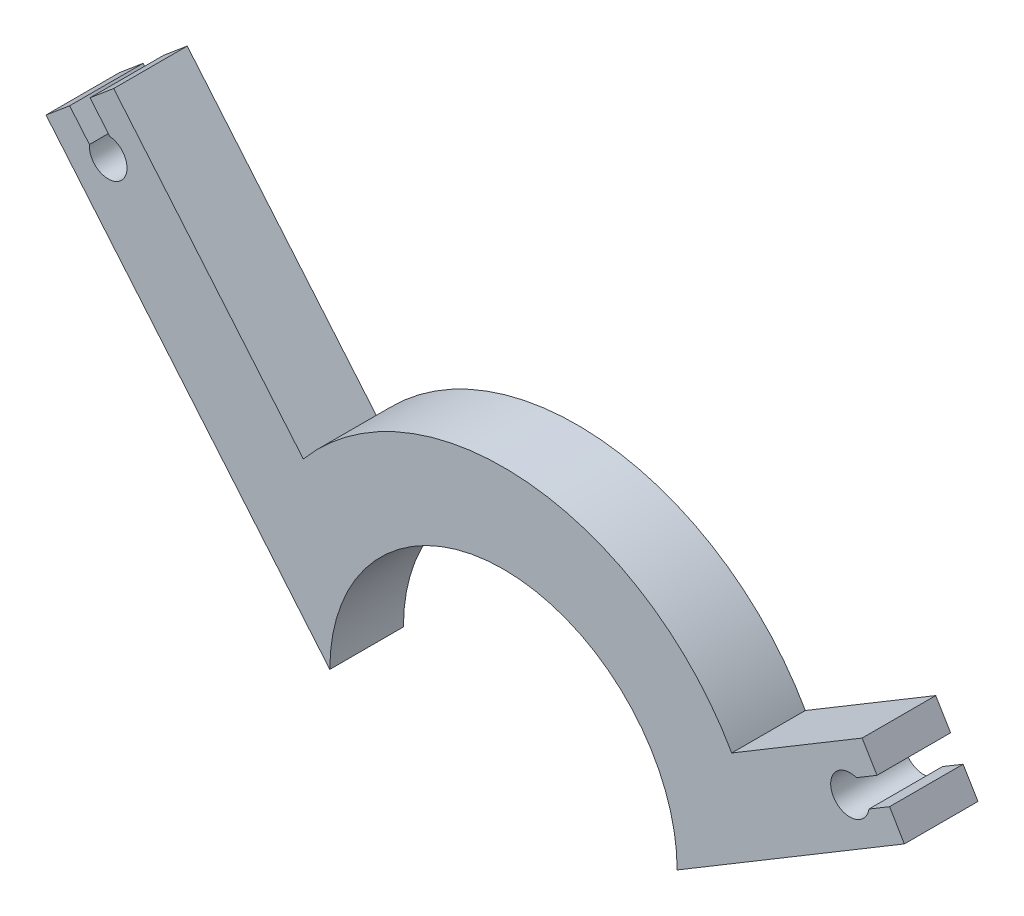
ISO-10303-21;
HEADER;
FILE_DESCRIPTION(('STEP AP214'),'2;1');
FILE_NAME('part.step','',(''),(''),'','','');
FILE_SCHEMA(('AUTOMOTIVE_DESIGN { 1 0 10303 214 1 1 1 1 }'));
ENDSEC;
DATA;
#1=APPLICATION_CONTEXT('core data for automotive mechanical design processes');
#2=APPLICATION_PROTOCOL_DEFINITION('international standard','automotive_design',2000,#1);
#3=PRODUCT_CONTEXT('',#1,'mechanical');
#4=PRODUCT('Part','Part','',(#3));
#5=PRODUCT_RELATED_PRODUCT_CATEGORY('part','',(#4));
#6=PRODUCT_DEFINITION_FORMATION('','',#4);
#7=PRODUCT_DEFINITION_CONTEXT('part definition',#1,'design');
#8=PRODUCT_DEFINITION('design','',#6,#7);
#9=PRODUCT_DEFINITION_SHAPE('','',#8);
#10=(LENGTH_UNIT() NAMED_UNIT(*) SI_UNIT(.MILLI.,.METRE.));
#11=(NAMED_UNIT(*) PLANE_ANGLE_UNIT() SI_UNIT($,.RADIAN.));
#12=(NAMED_UNIT(*) SI_UNIT($,.STERADIAN.) SOLID_ANGLE_UNIT());
#13=UNCERTAINTY_MEASURE_WITH_UNIT(LENGTH_MEASURE(1.E-05),#10,'distance_accuracy_value','');
#14=(GEOMETRIC_REPRESENTATION_CONTEXT(3) GLOBAL_UNCERTAINTY_ASSIGNED_CONTEXT((#13)) GLOBAL_UNIT_ASSIGNED_CONTEXT((#10,
#11,#12)) REPRESENTATION_CONTEXT('',''));
#15=CARTESIAN_POINT('',(0.,0.,0.));
#16=DIRECTION('',(0.,0.,1.));
#17=DIRECTION('',(1.,0.,0.));
#18=AXIS2_PLACEMENT_3D('',#15,#16,#17);
#19=CARTESIAN_POINT('',(0.,0.,1.5875));
#20=DIRECTION('',(0.,0.,-1.));
#21=DIRECTION('',(-1.,0.,0.));
#22=AXIS2_PLACEMENT_3D('',#19,#20,#21);
#23=CYLINDRICAL_SURFACE('',#22,3.7465);
#24=CARTESIAN_POINT('',(0.,0.,0.));
#25=DIRECTION('',(0.,0.,-1.));
#26=DIRECTION('',(1.,0.,0.));
#27=AXIS2_PLACEMENT_3D('',#24,#25,#26);
#28=CIRCLE('',#27,3.7465);
#29=CARTESIAN_POINT('',(-3.7465,0.,0.));
#30=VERTEX_POINT('',#29);
#31=CARTESIAN_POINT('',(3.7465,0.,0.));
#32=VERTEX_POINT('',#31);
#33=EDGE_CURVE('E176',#30,#32,#28,.T.);
#34=ORIENTED_EDGE('',*,*,#33,.T.);
#35=DIRECTION('',(0.,0.,-1.));
#36=VECTOR('',#35,1.);
#37=CARTESIAN_POINT('',(3.7465,0.,1.5875));
#38=LINE('',#37,#36);
#39=CARTESIAN_POINT('',(3.7465,0.,1.5875));
#40=VERTEX_POINT('',#39);
#41=EDGE_CURVE('E11',#40,#32,#38,.T.);
#42=ORIENTED_EDGE('',*,*,#41,.F.);
#43=CARTESIAN_POINT('',(0.,0.,1.5875));
#44=DIRECTION('',(0.,0.,-1.));
#45=DIRECTION('',(1.,0.,0.));
#46=AXIS2_PLACEMENT_3D('',#43,#44,#45);
#47=CIRCLE('',#46,3.7465);
#48=CARTESIAN_POINT('',(-3.7465,0.,1.5875));
#49=VERTEX_POINT('',#48);
#50=EDGE_CURVE('E206',#49,#40,#47,.T.);
#51=ORIENTED_EDGE('',*,*,#50,.F.);
#52=DIRECTION('',(0.,0.,-1.));
#53=VECTOR('',#52,1.);
#54=CARTESIAN_POINT('',(-3.7465,0.,1.5875));
#55=LINE('',#54,#53);
#56=EDGE_CURVE('E172',#49,#30,#55,.T.);
#57=ORIENTED_EDGE('',*,*,#56,.T.);
#58=EDGE_LOOP('',(#34,#42,#51,#57));
#59=FACE_BOUND('',#58,.T.);
#60=ADVANCED_FACE('F32',(#59),#23,.F.);
#61=CARTESIAN_POINT('',(3.7465,0.,1.5875));
#62=DIRECTION('',(-0.51400178949124,0.857789111844982,0.));
#63=DIRECTION('',(-0.857789111844982,-0.51400178949124,0.));
#64=AXIS2_PLACEMENT_3D('',#61,#62,#63);
#65=PLANE('',#64);
#66=DIRECTION('',(0.857789111844982,0.51400178949124,0.));
#67=VECTOR('',#66,1.);
#68=CARTESIAN_POINT('',(3.7465,0.,0.));
#69=LINE('',#68,#67);
#70=CARTESIAN_POINT('',(8.64876477419407,2.93752022694244,0.));
#71=VERTEX_POINT('',#70);
#72=EDGE_CURVE('E179',#32,#71,#69,.T.);
#73=ORIENTED_EDGE('',*,*,#72,.T.);
#74=DIRECTION('',(0.,0.,-1.));
#75=VECTOR('',#74,1.);
#76=CARTESIAN_POINT('',(8.64876477419407,2.93752022694244,1.5875));
#77=LINE('',#76,#75);
#78=CARTESIAN_POINT('',(8.64876477419407,2.93752022694244,1.5875));
#79=VERTEX_POINT('',#78);
#80=EDGE_CURVE('E40',#79,#71,#77,.T.);
#81=ORIENTED_EDGE('',*,*,#80,.F.);
#82=DIRECTION('',(0.857789111844982,0.51400178949124,0.));
#83=VECTOR('',#82,1.);
#84=CARTESIAN_POINT('',(3.7465,0.,1.5875));
#85=LINE('',#84,#83);
#86=EDGE_CURVE('E115',#40,#79,#85,.T.);
#87=ORIENTED_EDGE('',*,*,#86,.F.);
#88=ORIENTED_EDGE('',*,*,#41,.T.);
#89=EDGE_LOOP('',(#73,#81,#87,#88));
#90=FACE_BOUND('',#89,.T.);
#91=ADVANCED_FACE('F304',(#90),#65,.F.);
#92=CARTESIAN_POINT('',(8.64876477419407,2.93752022694244,1.5875));
#93=DIRECTION('',(-0.857789111844981,-0.514001789491241,0.));
#94=DIRECTION('',(0.514001789491241,-0.857789111844981,0.));
#95=AXIS2_PLACEMENT_3D('',#92,#93,#94);
#96=PLANE('',#95);
#97=DIRECTION('',(-0.514001789491241,0.857789111844981,0.));
#98=VECTOR('',#97,1.);
#99=CARTESIAN_POINT('',(8.64876477419407,2.93752022694244,0.));
#100=LINE('',#99,#98);
#101=CARTESIAN_POINT('',(8.32784963015071,3.4730777328006,0.));
#102=VERTEX_POINT('',#101);
#103=EDGE_CURVE('E181',#71,#102,#100,.T.);
#104=ORIENTED_EDGE('',*,*,#103,.T.);
#105=DIRECTION('',(0.,0.,-1.));
#106=VECTOR('',#105,1.);
#107=CARTESIAN_POINT('',(8.32784963015071,3.4730777328006,1.5875));
#108=LINE('',#107,#106);
#109=CARTESIAN_POINT('',(8.32784963015071,3.4730777328006,1.5875));
#110=VERTEX_POINT('',#109);
#111=EDGE_CURVE('E237',#110,#102,#108,.T.);
#112=ORIENTED_EDGE('',*,*,#111,.F.);
#113=DIRECTION('',(-0.514001789491241,0.857789111844981,0.));
#114=VECTOR('',#113,1.);
#115=CARTESIAN_POINT('',(8.64876477419407,2.93752022694244,1.5875));
#116=LINE('',#115,#114);
#117=EDGE_CURVE('E245',#79,#110,#116,.T.);
#118=ORIENTED_EDGE('',*,*,#117,.F.);
#119=ORIENTED_EDGE('',*,*,#80,.T.);
#120=EDGE_LOOP('',(#104,#112,#118,#119));
#121=FACE_BOUND('',#120,.T.);
#122=ADVANCED_FACE('F243',(#121),#96,.F.);
#123=CARTESIAN_POINT('',(8.32784963015071,3.4730777328006,1.5875));
#124=DIRECTION('',(0.514001789491243,-0.85778911184498,0.));
#125=DIRECTION('',(0.85778911184498,0.514001789491243,0.));
#126=AXIS2_PLACEMENT_3D('',#123,#124,#125);
#127=PLANE('',#126);
#128=DIRECTION('',(-0.85778911184498,-0.514001789491243,0.));
#129=VECTOR('',#128,1.);
#130=CARTESIAN_POINT('',(8.32784963015071,3.4730777328006,0.));
#131=LINE('',#130,#129);
#132=CARTESIAN_POINT('',(7.88298717588792,3.20650860245023,0.));
#133=VERTEX_POINT('',#132);
#134=EDGE_CURVE('E183',#102,#133,#131,.T.);
#135=ORIENTED_EDGE('',*,*,#134,.T.);
#136=DIRECTION('',(0.,0.,-1.));
#137=VECTOR('',#136,1.);
#138=CARTESIAN_POINT('',(7.88298717588792,3.20650860245023,1.5875));
#139=LINE('',#138,#137);
#140=CARTESIAN_POINT('',(7.88298717588792,3.20650860245023,1.5875));
#141=VERTEX_POINT('',#140);
#142=EDGE_CURVE('E234',#141,#133,#139,.T.);
#143=ORIENTED_EDGE('',*,*,#142,.F.);
#144=DIRECTION('',(-0.85778911184498,-0.514001789491243,0.));
#145=VECTOR('',#144,1.);
#146=CARTESIAN_POINT('',(8.32784963015071,3.4730777328006,1.5875));
#147=LINE('',#146,#145);
#148=EDGE_CURVE('E263',#110,#141,#147,.T.);
#149=ORIENTED_EDGE('',*,*,#148,.F.);
#150=ORIENTED_EDGE('',*,*,#111,.T.);
#151=EDGE_LOOP('',(#135,#143,#149,#150));
#152=FACE_BOUND('',#151,.T.);
#153=ADVANCED_FACE('F254',(#152),#127,.F.);
#154=CARTESIAN_POINT('',(7.47262979513493,3.26709872392423,1.5875));
#155=DIRECTION('',(0.,0.,-1.));
#156=DIRECTION('',(-1.,0.,0.));
#157=AXIS2_PLACEMENT_3D('',#154,#155,#156);
#158=CYLINDRICAL_SURFACE('',#157,0.414806391897093);
#159=CARTESIAN_POINT('',(7.47262979513493,3.26709872392423,0.));
#160=DIRECTION('',(0.,0.,-1.));
#161=DIRECTION('',(1.,0.,0.));
#162=AXIS2_PLACEMENT_3D('',#159,#160,#161);
#163=CIRCLE('',#162,0.414806391897093);
#164=CARTESIAN_POINT('',(7.61272711717027,3.65753064259536,0.));
#165=VERTEX_POINT('',#164);
#166=EDGE_CURVE('E185',#133,#165,#163,.T.);
#167=ORIENTED_EDGE('',*,*,#166,.T.);
#168=DIRECTION('',(0.,0.,-1.));
#169=VECTOR('',#168,1.);
#170=CARTESIAN_POINT('',(7.61272711717027,3.65753064259536,1.5875));
#171=LINE('',#170,#169);
#172=CARTESIAN_POINT('',(7.61272711717027,3.65753064259536,1.5875));
#173=VERTEX_POINT('',#172);
#174=EDGE_CURVE('E231',#173,#165,#171,.T.);
#175=ORIENTED_EDGE('',*,*,#174,.F.);
#176=CARTESIAN_POINT('',(7.47262979513493,3.26709872392423,1.5875));
#177=DIRECTION('',(0.,0.,-1.));
#178=DIRECTION('',(1.,0.,0.));
#179=AXIS2_PLACEMENT_3D('',#176,#177,#178);
#180=CIRCLE('',#179,0.414806391897093);
#181=EDGE_CURVE('E260',#141,#173,#180,.T.);
#182=ORIENTED_EDGE('',*,*,#181,.F.);
#183=ORIENTED_EDGE('',*,*,#142,.T.);
#184=EDGE_LOOP('',(#167,#175,#182,#183));
#185=FACE_BOUND('',#184,.T.);
#186=ADVANCED_FACE('F258',(#185),#158,.F.);
#187=CARTESIAN_POINT('',(8.05758957143306,3.92409977294573,1.5875));
#188=DIRECTION('',(-0.514001789491239,0.857789111844983,0.));
#189=DIRECTION('',(-0.857789111844983,-0.514001789491239,0.));
#190=AXIS2_PLACEMENT_3D('',#187,#188,#189);
#191=PLANE('',#190);
#192=DIRECTION('',(0.857789111844983,0.514001789491239,0.));
#193=VECTOR('',#192,1.);
#194=CARTESIAN_POINT('',(8.05758957143306,3.92409977294573,0.));
#195=LINE('',#194,#193);
#196=CARTESIAN_POINT('',(8.05758957143306,3.92409977294573,0.));
#197=VERTEX_POINT('',#196);
#198=EDGE_CURVE('E187',#165,#197,#195,.T.);
#199=ORIENTED_EDGE('',*,*,#198,.T.);
#200=DIRECTION('',(0.,0.,-1.));
#201=VECTOR('',#200,1.);
#202=CARTESIAN_POINT('',(8.05758957143306,3.92409977294573,1.5875));
#203=LINE('',#202,#201);
#204=CARTESIAN_POINT('',(8.05758957143306,3.92409977294573,1.5875));
#205=VERTEX_POINT('',#204);
#206=EDGE_CURVE('E228',#205,#197,#203,.T.);
#207=ORIENTED_EDGE('',*,*,#206,.F.);
#208=DIRECTION('',(0.857789111844983,0.514001789491239,0.));
#209=VECTOR('',#208,1.);
#210=CARTESIAN_POINT('',(8.05758957143306,3.92409977294573,1.5875));
#211=LINE('',#210,#209);
#212=EDGE_CURVE('E262',#173,#205,#211,.T.);
#213=ORIENTED_EDGE('',*,*,#212,.F.);
#214=ORIENTED_EDGE('',*,*,#174,.T.);
#215=EDGE_LOOP('',(#199,#207,#213,#214));
#216=FACE_BOUND('',#215,.T.);
#217=ADVANCED_FACE('F317',(#216),#191,.F.);
#218=CARTESIAN_POINT('',(8.05758957143306,3.92409977294573,1.5875));
#219=DIRECTION('',(-0.857789111844982,-0.514001789491241,0.));
#220=DIRECTION('',(0.514001789491241,-0.857789111844982,0.));
#221=AXIS2_PLACEMENT_3D('',#218,#219,#220);
#222=PLANE('',#221);
#223=DIRECTION('',(-0.514001789491241,0.857789111844982,0.));
#224=VECTOR('',#223,1.);
#225=CARTESIAN_POINT('',(8.05758957143306,3.92409977294573,0.));
#226=LINE('',#225,#224);
#227=CARTESIAN_POINT('',(7.73667442738969,4.4596572788039,0.));
#228=VERTEX_POINT('',#227);
#229=EDGE_CURVE('E189',#197,#228,#226,.T.);
#230=ORIENTED_EDGE('',*,*,#229,.T.);
#231=DIRECTION('',(0.,0.,-1.));
#232=VECTOR('',#231,1.);
#233=CARTESIAN_POINT('',(7.73667442738969,4.4596572788039,1.5875));
#234=LINE('',#233,#232);
#235=CARTESIAN_POINT('',(7.73667442738969,4.4596572788039,1.5875));
#236=VERTEX_POINT('',#235);
#237=EDGE_CURVE('E225',#236,#228,#234,.T.);
#238=ORIENTED_EDGE('',*,*,#237,.F.);
#239=DIRECTION('',(-0.514001789491241,0.857789111844982,0.));
#240=VECTOR('',#239,1.);
#241=CARTESIAN_POINT('',(8.05758957143306,3.92409977294573,1.5875));
#242=LINE('',#241,#240);
#243=EDGE_CURVE('E265',#205,#236,#242,.T.);
#244=ORIENTED_EDGE('',*,*,#243,.F.);
#245=ORIENTED_EDGE('',*,*,#206,.T.);
#246=EDGE_LOOP('',(#230,#238,#244,#245));
#247=FACE_BOUND('',#246,.T.);
#248=ADVANCED_FACE('F320',(#247),#222,.F.);
#249=CARTESIAN_POINT('',(7.73667442738969,4.4596572788039,1.5875));
#250=DIRECTION('',(0.514001789491241,-0.857789111844982,0.));
#251=DIRECTION('',(0.857789111844982,0.514001789491241,0.));
#252=AXIS2_PLACEMENT_3D('',#249,#250,#251);
#253=PLANE('',#252);
#254=DIRECTION('',(-0.857789111844982,-0.514001789491241,0.));
#255=VECTOR('',#254,1.);
#256=CARTESIAN_POINT('',(7.73667442738969,4.4596572788039,0.));
#257=LINE('',#256,#255);
#258=CARTESIAN_POINT('',(4.92378631338093,2.77412699604084,0.));
#259=VERTEX_POINT('',#258);
#260=EDGE_CURVE('E191',#228,#259,#257,.T.);
#261=ORIENTED_EDGE('',*,*,#260,.T.);
#262=DIRECTION('',(0.,0.,-1.));
#263=VECTOR('',#262,1.);
#264=CARTESIAN_POINT('',(4.92378631338093,2.77412699604084,1.5875));
#265=LINE('',#264,#263);
#266=CARTESIAN_POINT('',(4.92378631338093,2.77412699604084,1.5875));
#267=VERTEX_POINT('',#266);
#268=EDGE_CURVE('E222',#267,#259,#265,.T.);
#269=ORIENTED_EDGE('',*,*,#268,.F.);
#270=DIRECTION('',(-0.857789111844982,-0.514001789491241,0.));
#271=VECTOR('',#270,1.);
#272=CARTESIAN_POINT('',(7.73667442738969,4.4596572788039,1.5875));
#273=LINE('',#272,#271);
#274=EDGE_CURVE('E271',#236,#267,#273,.T.);
#275=ORIENTED_EDGE('',*,*,#274,.F.);
#276=ORIENTED_EDGE('',*,*,#237,.T.);
#277=EDGE_LOOP('',(#261,#269,#275,#276));
#278=FACE_BOUND('',#277,.T.);
#279=ADVANCED_FACE('F324',(#278),#253,.F.);
#280=CARTESIAN_POINT('',(0.,0.,1.5875));
#281=DIRECTION('',(0.,0.,-1.));
#282=DIRECTION('',(-1.,0.,0.));
#283=AXIS2_PLACEMENT_3D('',#280,#281,#282);
#284=CYLINDRICAL_SURFACE('',#283,5.6515);
#285=CARTESIAN_POINT('',(0.,0.,0.));
#286=DIRECTION('',(0.,0.,1.));
#287=DIRECTION('',(1.,0.,0.));
#288=AXIS2_PLACEMENT_3D('',#285,#286,#287);
#289=CIRCLE('',#288,5.6515);
#290=CARTESIAN_POINT('',(-4.31858822378173,3.64544208614178,0.));
#291=VERTEX_POINT('',#290);
#292=EDGE_CURVE('E193',#259,#291,#289,.T.);
#293=ORIENTED_EDGE('',*,*,#292,.T.);
#294=DIRECTION('',(0.,0.,-1.));
#295=VECTOR('',#294,1.);
#296=CARTESIAN_POINT('',(-4.31858822378173,3.64544208614178,1.5875));
#297=LINE('',#296,#295);
#298=CARTESIAN_POINT('',(-4.31858822378173,3.64544208614178,1.5875));
#299=VERTEX_POINT('',#298);
#300=EDGE_CURVE('E219',#299,#291,#297,.T.);
#301=ORIENTED_EDGE('',*,*,#300,.F.);
#302=CARTESIAN_POINT('',(0.,0.,1.5875));
#303=DIRECTION('',(0.,0.,1.));
#304=DIRECTION('',(1.,0.,0.));
#305=AXIS2_PLACEMENT_3D('',#302,#303,#304);
#306=CIRCLE('',#305,5.6515);
#307=EDGE_CURVE('E273',#267,#299,#306,.T.);
#308=ORIENTED_EDGE('',*,*,#307,.F.);
#309=ORIENTED_EDGE('',*,*,#268,.T.);
#310=EDGE_LOOP('',(#293,#301,#308,#309));
#311=FACE_BOUND('',#310,.T.);
#312=ADVANCED_FACE('F328',(#311),#284,.T.);
#313=CARTESIAN_POINT('',(-8.40973731812269,8.52108371716109,1.5875));
#314=DIRECTION('',(-0.766044443118973,-0.642787609686545,0.));
#315=DIRECTION('',(0.642787609686545,-0.766044443118973,0.));
#316=AXIS2_PLACEMENT_3D('',#313,#314,#315);
#317=PLANE('',#316);
#318=DIRECTION('',(-0.642787609686546,0.766044443118973,0.));
#319=VECTOR('',#318,1.);
#320=CARTESIAN_POINT('',(-8.40973731812269,8.52108371716109,0.));
#321=LINE('',#320,#319);
#322=CARTESIAN_POINT('',(-8.40973731812269,8.52108371716109,0.));
#323=VERTEX_POINT('',#322);
#324=EDGE_CURVE('E195',#291,#323,#321,.T.);
#325=ORIENTED_EDGE('',*,*,#324,.T.);
#326=DIRECTION('',(0.,0.,-1.));
#327=VECTOR('',#326,1.);
#328=CARTESIAN_POINT('',(-8.40973731812269,8.52108371716109,1.5875));
#329=LINE('',#328,#327);
#330=CARTESIAN_POINT('',(-8.40973731812269,8.52108371716109,1.5875));
#331=VERTEX_POINT('',#330);
#332=EDGE_CURVE('E216',#331,#323,#329,.T.);
#333=ORIENTED_EDGE('',*,*,#332,.F.);
#334=DIRECTION('',(-0.642787609686546,0.766044443118973,0.));
#335=VECTOR('',#334,1.);
#336=CARTESIAN_POINT('',(-8.40973731812269,8.52108371716109,1.5875));
#337=LINE('',#336,#335);
#338=EDGE_CURVE('E275',#299,#331,#337,.T.);
#339=ORIENTED_EDGE('',*,*,#338,.F.);
#340=ORIENTED_EDGE('',*,*,#300,.T.);
#341=EDGE_LOOP('',(#325,#333,#339,#340));
#342=FACE_BOUND('',#341,.T.);
#343=ADVANCED_FACE('F332',(#342),#317,.F.);
#344=CARTESIAN_POINT('',(-8.91925784061496,8.09354523466057,1.5875));
#345=DIRECTION('',(0.642787609686547,-0.766044443118971,0.));
#346=DIRECTION('',(0.766044443118971,0.642787609686548,0.));
#347=AXIS2_PLACEMENT_3D('',#344,#345,#346);
#348=PLANE('',#347);
#349=DIRECTION('',(-0.766044443118971,-0.642787609686548,0.));
#350=VECTOR('',#349,1.);
#351=CARTESIAN_POINT('',(-8.91925784061496,8.09354523466057,0.));
#352=LINE('',#351,#350);
#353=CARTESIAN_POINT('',(-8.91925784061496,8.09354523466057,0.));
#354=VERTEX_POINT('',#353);
#355=EDGE_CURVE('E197',#323,#354,#352,.T.);
#356=ORIENTED_EDGE('',*,*,#355,.T.);
#357=DIRECTION('',(0.,0.,-1.));
#358=VECTOR('',#357,1.);
#359=CARTESIAN_POINT('',(-8.91925784061496,8.09354523466057,1.5875));
#360=LINE('',#359,#358);
#361=CARTESIAN_POINT('',(-8.91925784061496,8.09354523466057,1.5875));
#362=VERTEX_POINT('',#361);
#363=EDGE_CURVE('E213',#362,#354,#360,.T.);
#364=ORIENTED_EDGE('',*,*,#363,.F.);
#365=DIRECTION('',(-0.766044443118971,-0.642787609686548,0.));
#366=VECTOR('',#365,1.);
#367=CARTESIAN_POINT('',(-8.91925784061496,8.09354523466057,1.5875));
#368=LINE('',#367,#366);
#369=EDGE_CURVE('E277',#331,#362,#368,.T.);
#370=ORIENTED_EDGE('',*,*,#369,.F.);
#371=ORIENTED_EDGE('',*,*,#332,.T.);
#372=EDGE_LOOP('',(#356,#364,#370,#371));
#373=FACE_BOUND('',#372,.T.);
#374=ADVANCED_FACE('F336',(#373),#348,.F.);
#375=CARTESIAN_POINT('',(-8.91925784061496,8.09354523466057,1.5875));
#376=DIRECTION('',(0.766044443118971,0.642787609686547,0.));
#377=DIRECTION('',(-0.642787609686547,0.766044443118971,0.));
#378=AXIS2_PLACEMENT_3D('',#375,#376,#377);
#379=PLANE('',#378);
#380=DIRECTION('',(0.642787609686547,-0.766044443118971,0.));
#381=VECTOR('',#380,1.);
#382=CARTESIAN_POINT('',(-8.91925784061496,8.09354523466057,0.));
#383=LINE('',#382,#381);
#384=CARTESIAN_POINT('',(-8.49171935811445,7.58402471216831,0.));
#385=VERTEX_POINT('',#384);
#386=EDGE_CURVE('E199',#354,#385,#383,.T.);
#387=ORIENTED_EDGE('',*,*,#386,.T.);
#388=DIRECTION('',(0.,0.,-1.));
#389=VECTOR('',#388,1.);
#390=CARTESIAN_POINT('',(-8.49171935811445,7.58402471216831,1.5875));
#391=LINE('',#390,#389);
#392=CARTESIAN_POINT('',(-8.49171935811445,7.58402471216831,1.5875));
#393=VERTEX_POINT('',#392);
#394=EDGE_CURVE('E210',#393,#385,#391,.T.);
#395=ORIENTED_EDGE('',*,*,#394,.F.);
#396=DIRECTION('',(0.642787609686547,-0.766044443118971,0.));
#397=VECTOR('',#396,1.);
#398=CARTESIAN_POINT('',(-8.91925784061496,8.09354523466057,1.5875));
#399=LINE('',#398,#397);
#400=EDGE_CURVE('E279',#362,#393,#399,.T.);
#401=ORIENTED_EDGE('',*,*,#400,.F.);
#402=ORIENTED_EDGE('',*,*,#363,.T.);
#403=EDGE_LOOP('',(#387,#395,#401,#402));
#404=FACE_BOUND('',#403,.T.);
#405=ADVANCED_FACE('F285',(#404),#379,.F.);
#406=CARTESIAN_POINT('',(-8.52713945196709,7.17917118686382,1.5875));
#407=DIRECTION('',(0.,0.,-1.));
#408=DIRECTION('',(-1.,0.,0.));
#409=AXIS2_PLACEMENT_3D('',#406,#407,#408);
#410=CYLINDRICAL_SURFACE('',#409,0.4064);
#411=CARTESIAN_POINT('',(-8.52713945196709,7.17917118686382,0.));
#412=DIRECTION('',(0.,0.,-1.));
#413=DIRECTION('',(1.,0.,0.));
#414=AXIS2_PLACEMENT_3D('',#411,#412,#413);
#415=CIRCLE('',#414,0.4064);
#416=CARTESIAN_POINT('',(-8.93199297727157,7.21459128071647,0.));
#417=VERTEX_POINT('',#416);
#418=EDGE_CURVE('E201',#385,#417,#415,.T.);
#419=ORIENTED_EDGE('',*,*,#418,.T.);
#420=DIRECTION('',(0.,0.,-1.));
#421=VECTOR('',#420,1.);
#422=CARTESIAN_POINT('',(-8.93199297727157,7.21459128071647,1.5875));
#423=LINE('',#422,#421);
#424=CARTESIAN_POINT('',(-8.93199297727157,7.21459128071647,1.5875));
#425=VERTEX_POINT('',#424);
#426=EDGE_CURVE('E167',#425,#417,#423,.T.);
#427=ORIENTED_EDGE('',*,*,#426,.F.);
#428=CARTESIAN_POINT('',(-8.52713945196709,7.17917118686382,1.5875));
#429=DIRECTION('',(0.,0.,-1.));
#430=DIRECTION('',(1.,0.,0.));
#431=AXIS2_PLACEMENT_3D('',#428,#429,#430);
#432=CIRCLE('',#431,0.4064);
#433=EDGE_CURVE('E158',#393,#425,#432,.T.);
#434=ORIENTED_EDGE('',*,*,#433,.F.);
#435=ORIENTED_EDGE('',*,*,#394,.T.);
#436=EDGE_LOOP('',(#419,#427,#434,#435));
#437=FACE_BOUND('',#436,.T.);
#438=ADVANCED_FACE('F289',(#437),#410,.F.);
#439=CARTESIAN_POINT('',(-9.35953145977209,7.72411180320873,1.5875));
#440=DIRECTION('',(-0.766044443118974,-0.642787609686544,0.));
#441=DIRECTION('',(0.642787609686544,-0.766044443118975,0.));
#442=AXIS2_PLACEMENT_3D('',#439,#440,#441);
#443=PLANE('',#442);
#444=DIRECTION('',(-0.642787609686544,0.766044443118974,0.));
#445=VECTOR('',#444,1.);
#446=CARTESIAN_POINT('',(-9.35953145977209,7.72411180320873,0.));
#447=LINE('',#446,#445);
#448=CARTESIAN_POINT('',(-9.35953145977209,7.72411180320873,0.));
#449=VERTEX_POINT('',#448);
#450=EDGE_CURVE('E166',#417,#449,#447,.T.);
#451=ORIENTED_EDGE('',*,*,#450,.T.);
#452=DIRECTION('',(0.,0.,-1.));
#453=VECTOR('',#452,1.);
#454=CARTESIAN_POINT('',(-9.35953145977209,7.72411180320873,1.5875));
#455=LINE('',#454,#453);
#456=CARTESIAN_POINT('',(-9.35953145977209,7.72411180320873,1.5875));
#457=VERTEX_POINT('',#456);
#458=EDGE_CURVE('E163',#457,#449,#455,.T.);
#459=ORIENTED_EDGE('',*,*,#458,.F.);
#460=DIRECTION('',(-0.642787609686544,0.766044443118974,0.));
#461=VECTOR('',#460,1.);
#462=CARTESIAN_POINT('',(-9.35953145977209,7.72411180320873,1.5875));
#463=LINE('',#462,#461);
#464=EDGE_CURVE('E152',#425,#457,#463,.T.);
#465=ORIENTED_EDGE('',*,*,#464,.F.);
#466=ORIENTED_EDGE('',*,*,#426,.T.);
#467=EDGE_LOOP('',(#451,#459,#465,#466));
#468=FACE_BOUND('',#467,.T.);
#469=ADVANCED_FACE('F164',(#468),#443,.F.);
#470=CARTESIAN_POINT('',(-9.86905198226434,7.29657332070822,1.5875));
#471=DIRECTION('',(0.642787609686546,-0.766044443118973,0.));
#472=DIRECTION('',(0.766044443118973,0.642787609686546,0.));
#473=AXIS2_PLACEMENT_3D('',#470,#471,#472);
#474=PLANE('',#473);
#475=DIRECTION('',(-0.766044443118973,-0.642787609686546,0.));
#476=VECTOR('',#475,1.);
#477=CARTESIAN_POINT('',(-9.86905198226434,7.29657332070822,0.));
#478=LINE('',#477,#476);
#479=CARTESIAN_POINT('',(-9.86905198226434,7.29657332070822,0.));
#480=VERTEX_POINT('',#479);
#481=EDGE_CURVE('E101',#449,#480,#478,.T.);
#482=ORIENTED_EDGE('',*,*,#481,.T.);
#483=DIRECTION('',(0.,0.,-1.));
#484=VECTOR('',#483,1.);
#485=CARTESIAN_POINT('',(-9.86905198226434,7.29657332070822,1.5875));
#486=LINE('',#485,#484);
#487=CARTESIAN_POINT('',(-9.86905198226434,7.29657332070822,1.5875));
#488=VERTEX_POINT('',#487);
#489=EDGE_CURVE('E168',#488,#480,#486,.T.);
#490=ORIENTED_EDGE('',*,*,#489,.F.);
#491=DIRECTION('',(-0.766044443118973,-0.642787609686546,0.));
#492=VECTOR('',#491,1.);
#493=CARTESIAN_POINT('',(-9.86905198226434,7.29657332070822,1.5875));
#494=LINE('',#493,#492);
#495=EDGE_CURVE('E156',#457,#488,#494,.T.);
#496=ORIENTED_EDGE('',*,*,#495,.F.);
#497=ORIENTED_EDGE('',*,*,#458,.T.);
#498=EDGE_LOOP('',(#482,#490,#496,#497));
#499=FACE_BOUND('',#498,.T.);
#500=ADVANCED_FACE('F170',(#499),#474,.F.);
#501=CARTESIAN_POINT('',(-3.7465,0.,1.5875));
#502=DIRECTION('',(0.766044443118974,0.642787609686544,0.));
#503=DIRECTION('',(-0.642787609686544,0.766044443118974,0.));
#504=AXIS2_PLACEMENT_3D('',#501,#502,#503);
#505=PLANE('',#504);
#506=DIRECTION('',(0.642787609686545,-0.766044443118974,0.));
#507=VECTOR('',#506,1.);
#508=CARTESIAN_POINT('',(-3.7465,0.,0.));
#509=LINE('',#508,#507);
#510=EDGE_CURVE('E107',#480,#30,#509,.T.);
#511=ORIENTED_EDGE('',*,*,#510,.T.);
#512=ORIENTED_EDGE('',*,*,#56,.F.);
#513=DIRECTION('',(0.642787609686545,-0.766044443118974,0.));
#514=VECTOR('',#513,1.);
#515=CARTESIAN_POINT('',(-3.7465,0.,1.5875));
#516=LINE('',#515,#514);
#517=EDGE_CURVE('E48',#488,#49,#516,.T.);
#518=ORIENTED_EDGE('',*,*,#517,.F.);
#519=ORIENTED_EDGE('',*,*,#489,.T.);
#520=EDGE_LOOP('',(#511,#512,#518,#519));
#521=FACE_BOUND('',#520,.T.);
#522=ADVANCED_FACE('F293',(#521),#505,.F.);
#523=CARTESIAN_POINT('',(0.,0.,1.5875));
#524=DIRECTION('',(0.,0.,1.));
#525=DIRECTION('',(1.,0.,0.));
#526=AXIS2_PLACEMENT_3D('',#523,#524,#525);
#527=PLANE('',#526);
#528=ORIENTED_EDGE('',*,*,#50,.T.);
#529=ORIENTED_EDGE('',*,*,#86,.T.);
#530=ORIENTED_EDGE('',*,*,#117,.T.);
#531=ORIENTED_EDGE('',*,*,#148,.T.);
#532=ORIENTED_EDGE('',*,*,#181,.T.);
#533=ORIENTED_EDGE('',*,*,#212,.T.);
#534=ORIENTED_EDGE('',*,*,#243,.T.);
#535=ORIENTED_EDGE('',*,*,#274,.T.);
#536=ORIENTED_EDGE('',*,*,#307,.T.);
#537=ORIENTED_EDGE('',*,*,#338,.T.);
#538=ORIENTED_EDGE('',*,*,#369,.T.);
#539=ORIENTED_EDGE('',*,*,#400,.T.);
#540=ORIENTED_EDGE('',*,*,#433,.T.);
#541=ORIENTED_EDGE('',*,*,#464,.T.);
#542=ORIENTED_EDGE('',*,*,#495,.T.);
#543=ORIENTED_EDGE('',*,*,#517,.T.);
#544=EDGE_LOOP('',(#528,#529,#530,#531,#532,#533,#534,#535,#536,#537,#538,#539,#540,#541,#542,#543));
#545=FACE_BOUND('',#544,.T.);
#546=ADVANCED_FACE('F154',(#545),#527,.T.);
#547=CARTESIAN_POINT('',(0.,0.,0.));
#548=DIRECTION('',(0.,0.,1.));
#549=DIRECTION('',(1.,0.,0.));
#550=AXIS2_PLACEMENT_3D('',#547,#548,#549);
#551=PLANE('',#550);
#552=ORIENTED_EDGE('',*,*,#33,.F.);
#553=ORIENTED_EDGE('',*,*,#510,.F.);
#554=ORIENTED_EDGE('',*,*,#481,.F.);
#555=ORIENTED_EDGE('',*,*,#450,.F.);
#556=ORIENTED_EDGE('',*,*,#418,.F.);
#557=ORIENTED_EDGE('',*,*,#386,.F.);
#558=ORIENTED_EDGE('',*,*,#355,.F.);
#559=ORIENTED_EDGE('',*,*,#324,.F.);
#560=ORIENTED_EDGE('',*,*,#292,.F.);
#561=ORIENTED_EDGE('',*,*,#260,.F.);
#562=ORIENTED_EDGE('',*,*,#229,.F.);
#563=ORIENTED_EDGE('',*,*,#198,.F.);
#564=ORIENTED_EDGE('',*,*,#166,.F.);
#565=ORIENTED_EDGE('',*,*,#134,.F.);
#566=ORIENTED_EDGE('',*,*,#103,.F.);
#567=ORIENTED_EDGE('',*,*,#72,.F.);
#568=EDGE_LOOP('',(#552,#553,#554,#555,#556,#557,#558,#559,#560,#561,#562,#563,#564,#565,#566,#567));
#569=FACE_BOUND('',#568,.T.);
#570=ADVANCED_FACE('F249',(#569),#551,.F.);
#571=CLOSED_SHELL('',(#60,#91,#122,#153,#186,#217,#248,#279,#312,#343,#374,#405,#438,#469,#500,
#522,#546,#570));
#572=MANIFOLD_SOLID_BREP('B2',#571);
#573=ADVANCED_BREP_SHAPE_REPRESENTATION('',(#18,#572),#14);
#574=SHAPE_DEFINITION_REPRESENTATION(#9,#573);
ENDSEC;
END-ISO-10303-21;
